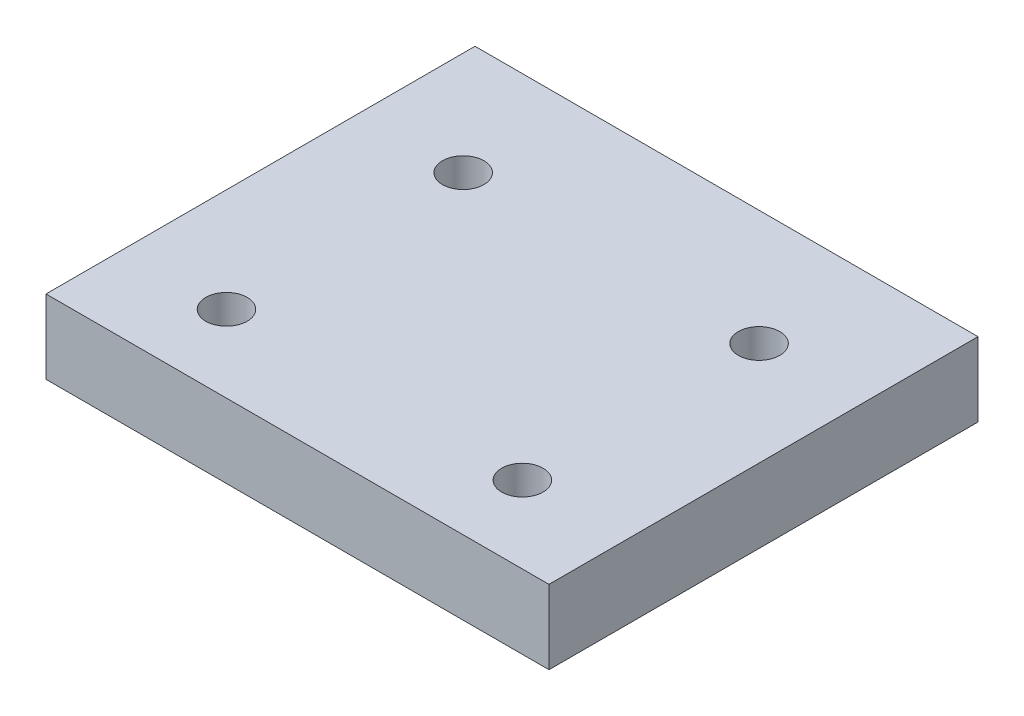
ISO-10303-21;
HEADER;
FILE_DESCRIPTION(('STEP AP214'),'2;1');
FILE_NAME('part.step','',(''),(''),'','','');
FILE_SCHEMA(('AUTOMOTIVE_DESIGN { 1 0 10303 214 1 1 1 1 }'));
ENDSEC;
DATA;
#1=APPLICATION_CONTEXT('core data for automotive mechanical design processes');
#2=APPLICATION_PROTOCOL_DEFINITION('international standard','automotive_design',2000,#1);
#3=PRODUCT_CONTEXT('',#1,'mechanical');
#4=PRODUCT('Part','Part','',(#3));
#5=PRODUCT_RELATED_PRODUCT_CATEGORY('part','',(#4));
#6=PRODUCT_DEFINITION_FORMATION('','',#4);
#7=PRODUCT_DEFINITION_CONTEXT('part definition',#1,'design');
#8=PRODUCT_DEFINITION('design','',#6,#7);
#9=PRODUCT_DEFINITION_SHAPE('','',#8);
#10=(LENGTH_UNIT() NAMED_UNIT(*) SI_UNIT(.MILLI.,.METRE.));
#11=(NAMED_UNIT(*) PLANE_ANGLE_UNIT() SI_UNIT($,.RADIAN.));
#12=(NAMED_UNIT(*) SI_UNIT($,.STERADIAN.) SOLID_ANGLE_UNIT());
#13=UNCERTAINTY_MEASURE_WITH_UNIT(LENGTH_MEASURE(1.E-05),#10,'distance_accuracy_value','');
#14=(GEOMETRIC_REPRESENTATION_CONTEXT(3) GLOBAL_UNCERTAINTY_ASSIGNED_CONTEXT((#13)) GLOBAL_UNIT_ASSIGNED_CONTEXT((#10,
#11,#12)) REPRESENTATION_CONTEXT('',''));
#15=CARTESIAN_POINT('',(0.,0.,0.));
#16=DIRECTION('',(0.,0.,1.));
#17=DIRECTION('',(1.,0.,0.));
#18=AXIS2_PLACEMENT_3D('',#15,#16,#17);
#19=CARTESIAN_POINT('',(0.,5.,0.));
#20=DIRECTION('',(0.,1.,0.));
#21=DIRECTION('',(0.,0.,1.));
#22=AXIS2_PLACEMENT_3D('',#19,#20,#21);
#23=PLANE('',#22);
#24=CARTESIAN_POINT('',(9.99999999999994,5.,-6.7));
#25=DIRECTION('',(0.,1.,0.));
#26=DIRECTION('',(0.,0.,1.));
#27=AXIS2_PLACEMENT_3D('',#24,#25,#26);
#28=CIRCLE('',#27,1.4);
#29=CARTESIAN_POINT('',(9.99999999999994,5.,-5.3));
#30=VERTEX_POINT('',#29);
#31=EDGE_CURVE('E148',#30,#30,#28,.T.);
#32=ORIENTED_EDGE('',*,*,#31,.F.);
#33=EDGE_LOOP('',(#32));
#34=FACE_BOUND('',#33,.T.);
#35=CARTESIAN_POINT('',(-10.,5.,9.3));
#36=DIRECTION('',(0.,1.,0.));
#37=DIRECTION('',(0.,0.,1.));
#38=AXIS2_PLACEMENT_3D('',#35,#36,#37);
#39=CIRCLE('',#38,1.4);
#40=CARTESIAN_POINT('',(-10.,5.,10.7));
#41=VERTEX_POINT('',#40);
#42=EDGE_CURVE('E118',#41,#41,#39,.T.);
#43=ORIENTED_EDGE('',*,*,#42,.F.);
#44=EDGE_LOOP('',(#43));
#45=FACE_BOUND('',#44,.T.);
#46=DIRECTION('',(0.,0.,-1.));
#47=VECTOR('',#46,1.);
#48=CARTESIAN_POINT('',(17.,5.,-14.5));
#49=LINE('',#48,#47);
#50=CARTESIAN_POINT('',(17.,5.,14.5));
#51=VERTEX_POINT('',#50);
#52=CARTESIAN_POINT('',(17.,5.,-14.5));
#53=VERTEX_POINT('',#52);
#54=EDGE_CURVE('E98',#51,#53,#49,.T.);
#55=ORIENTED_EDGE('',*,*,#54,.T.);
#56=DIRECTION('',(-1.,0.,0.));
#57=VECTOR('',#56,1.);
#58=CARTESIAN_POINT('',(-17.,5.,-14.5));
#59=LINE('',#58,#57);
#60=CARTESIAN_POINT('',(-17.,5.,-14.5));
#61=VERTEX_POINT('',#60);
#62=EDGE_CURVE('E93',#53,#61,#59,.T.);
#63=ORIENTED_EDGE('',*,*,#62,.T.);
#64=DIRECTION('',(0.,0.,1.));
#65=VECTOR('',#64,1.);
#66=CARTESIAN_POINT('',(-17.,5.,-14.5));
#67=LINE('',#66,#65);
#68=CARTESIAN_POINT('',(-17.,5.,14.5));
#69=VERTEX_POINT('',#68);
#70=EDGE_CURVE('E96',#61,#69,#67,.T.);
#71=ORIENTED_EDGE('',*,*,#70,.T.);
#72=DIRECTION('',(1.,0.,0.));
#73=VECTOR('',#72,1.);
#74=CARTESIAN_POINT('',(-17.,5.,14.5));
#75=LINE('',#74,#73);
#76=EDGE_CURVE('E63',#69,#51,#75,.T.);
#77=ORIENTED_EDGE('',*,*,#76,.T.);
#78=EDGE_LOOP('',(#55,#63,#71,#77));
#79=FACE_BOUND('',#78,.T.);
#80=CARTESIAN_POINT('',(10.,5.,9.3));
#81=DIRECTION('',(0.,1.,0.));
#82=DIRECTION('',(0.,0.,1.));
#83=AXIS2_PLACEMENT_3D('',#80,#81,#82);
#84=CIRCLE('',#83,1.4);
#85=CARTESIAN_POINT('',(10.,5.,10.7));
#86=VERTEX_POINT('',#85);
#87=EDGE_CURVE('E140',#86,#86,#84,.T.);
#88=ORIENTED_EDGE('',*,*,#87,.F.);
#89=EDGE_LOOP('',(#88));
#90=FACE_BOUND('',#89,.T.);
#91=CARTESIAN_POINT('',(-10.0000000000001,5.,-6.7));
#92=DIRECTION('',(0.,1.,0.));
#93=DIRECTION('',(0.,0.,1.));
#94=AXIS2_PLACEMENT_3D('',#91,#92,#93);
#95=CIRCLE('',#94,1.4);
#96=CARTESIAN_POINT('',(-10.0000000000001,5.,-5.3));
#97=VERTEX_POINT('',#96);
#98=EDGE_CURVE('E156',#97,#97,#95,.T.);
#99=ORIENTED_EDGE('',*,*,#98,.F.);
#100=EDGE_LOOP('',(#99));
#101=FACE_BOUND('',#100,.T.);
#102=ADVANCED_FACE('F45',(#34,#45,#79,#90,#101),#23,.T.);
#103=CARTESIAN_POINT('',(0.,0.,0.));
#104=DIRECTION('',(0.,1.,0.));
#105=DIRECTION('',(0.,0.,1.));
#106=AXIS2_PLACEMENT_3D('',#103,#104,#105);
#107=PLANE('',#106);
#108=DIRECTION('',(0.,0.,-1.));
#109=VECTOR('',#108,1.);
#110=CARTESIAN_POINT('',(17.,0.,-14.5));
#111=LINE('',#110,#109);
#112=CARTESIAN_POINT('',(17.,0.,14.5));
#113=VERTEX_POINT('',#112);
#114=CARTESIAN_POINT('',(17.,0.,-14.5));
#115=VERTEX_POINT('',#114);
#116=EDGE_CURVE('E114',#113,#115,#111,.T.);
#117=ORIENTED_EDGE('',*,*,#116,.F.);
#118=DIRECTION('',(1.,0.,0.));
#119=VECTOR('',#118,1.);
#120=CARTESIAN_POINT('',(-17.,0.,14.5));
#121=LINE('',#120,#119);
#122=CARTESIAN_POINT('',(-17.,0.,14.5));
#123=VERTEX_POINT('',#122);
#124=EDGE_CURVE('E86',#123,#113,#121,.T.);
#125=ORIENTED_EDGE('',*,*,#124,.F.);
#126=DIRECTION('',(0.,0.,1.));
#127=VECTOR('',#126,1.);
#128=CARTESIAN_POINT('',(-17.,0.,-14.5));
#129=LINE('',#128,#127);
#130=CARTESIAN_POINT('',(-17.,0.,-14.5));
#131=VERTEX_POINT('',#130);
#132=EDGE_CURVE('E80',#131,#123,#129,.T.);
#133=ORIENTED_EDGE('',*,*,#132,.F.);
#134=DIRECTION('',(-1.,0.,0.));
#135=VECTOR('',#134,1.);
#136=CARTESIAN_POINT('',(-17.,0.,-14.5));
#137=LINE('',#136,#135);
#138=EDGE_CURVE('E103',#115,#131,#137,.T.);
#139=ORIENTED_EDGE('',*,*,#138,.F.);
#140=EDGE_LOOP('',(#117,#125,#133,#139));
#141=FACE_BOUND('',#140,.T.);
#142=CARTESIAN_POINT('',(-10.,0.,9.3));
#143=DIRECTION('',(0.,1.,0.));
#144=DIRECTION('',(0.,0.,1.));
#145=AXIS2_PLACEMENT_3D('',#142,#143,#144);
#146=CIRCLE('',#145,1.4);
#147=CARTESIAN_POINT('',(-10.,0.,10.7));
#148=VERTEX_POINT('',#147);
#149=EDGE_CURVE('E136',#148,#148,#146,.T.);
#150=ORIENTED_EDGE('',*,*,#149,.T.);
#151=EDGE_LOOP('',(#150));
#152=FACE_BOUND('',#151,.T.);
#153=CARTESIAN_POINT('',(10.,0.,9.3));
#154=DIRECTION('',(0.,1.,0.));
#155=DIRECTION('',(0.,0.,1.));
#156=AXIS2_PLACEMENT_3D('',#153,#154,#155);
#157=CIRCLE('',#156,1.4);
#158=CARTESIAN_POINT('',(10.,0.,10.7));
#159=VERTEX_POINT('',#158);
#160=EDGE_CURVE('E144',#159,#159,#157,.T.);
#161=ORIENTED_EDGE('',*,*,#160,.T.);
#162=EDGE_LOOP('',(#161));
#163=FACE_BOUND('',#162,.T.);
#164=CARTESIAN_POINT('',(9.99999999999994,0.,-6.7));
#165=DIRECTION('',(0.,1.,0.));
#166=DIRECTION('',(0.,0.,1.));
#167=AXIS2_PLACEMENT_3D('',#164,#165,#166);
#168=CIRCLE('',#167,1.4);
#169=CARTESIAN_POINT('',(9.99999999999994,0.,-5.3));
#170=VERTEX_POINT('',#169);
#171=EDGE_CURVE('E152',#170,#170,#168,.T.);
#172=ORIENTED_EDGE('',*,*,#171,.T.);
#173=EDGE_LOOP('',(#172));
#174=FACE_BOUND('',#173,.T.);
#175=CARTESIAN_POINT('',(-10.0000000000001,0.,-6.7));
#176=DIRECTION('',(0.,1.,0.));
#177=DIRECTION('',(0.,0.,1.));
#178=AXIS2_PLACEMENT_3D('',#175,#176,#177);
#179=CIRCLE('',#178,1.4);
#180=CARTESIAN_POINT('',(-10.0000000000001,0.,-5.3));
#181=VERTEX_POINT('',#180);
#182=EDGE_CURVE('E160',#181,#181,#179,.T.);
#183=ORIENTED_EDGE('',*,*,#182,.T.);
#184=EDGE_LOOP('',(#183));
#185=FACE_BOUND('',#184,.T.);
#186=ADVANCED_FACE('F131',(#141,#152,#163,#174,#185),#107,.F.);
#187=CARTESIAN_POINT('',(17.,5.,-14.5));
#188=DIRECTION('',(-1.,0.,0.));
#189=DIRECTION('',(0.,0.,1.));
#190=AXIS2_PLACEMENT_3D('',#187,#188,#189);
#191=PLANE('',#190);
#192=ORIENTED_EDGE('',*,*,#116,.T.);
#193=DIRECTION('',(0.,-1.,0.));
#194=VECTOR('',#193,1.);
#195=CARTESIAN_POINT('',(17.,5.,-14.5));
#196=LINE('',#195,#194);
#197=EDGE_CURVE('E11',#53,#115,#196,.T.);
#198=ORIENTED_EDGE('',*,*,#197,.F.);
#199=ORIENTED_EDGE('',*,*,#54,.F.);
#200=DIRECTION('',(0.,-1.,0.));
#201=VECTOR('',#200,1.);
#202=CARTESIAN_POINT('',(17.,5.,14.5));
#203=LINE('',#202,#201);
#204=EDGE_CURVE('E110',#51,#113,#203,.T.);
#205=ORIENTED_EDGE('',*,*,#204,.T.);
#206=EDGE_LOOP('',(#192,#198,#199,#205));
#207=FACE_BOUND('',#206,.T.);
#208=ADVANCED_FACE('F47',(#207),#191,.F.);
#209=CARTESIAN_POINT('',(-17.,5.,-14.5));
#210=DIRECTION('',(0.,0.,1.));
#211=DIRECTION('',(1.,0.,0.));
#212=AXIS2_PLACEMENT_3D('',#209,#210,#211);
#213=PLANE('',#212);
#214=ORIENTED_EDGE('',*,*,#138,.T.);
#215=DIRECTION('',(0.,-1.,0.));
#216=VECTOR('',#215,1.);
#217=CARTESIAN_POINT('',(-17.,5.,-14.5));
#218=LINE('',#217,#216);
#219=EDGE_CURVE('E55',#61,#131,#218,.T.);
#220=ORIENTED_EDGE('',*,*,#219,.F.);
#221=ORIENTED_EDGE('',*,*,#62,.F.);
#222=ORIENTED_EDGE('',*,*,#197,.T.);
#223=EDGE_LOOP('',(#214,#220,#221,#222));
#224=FACE_BOUND('',#223,.T.);
#225=ADVANCED_FACE('F102',(#224),#213,.F.);
#226=CARTESIAN_POINT('',(-17.,5.,-14.5));
#227=DIRECTION('',(1.,0.,0.));
#228=DIRECTION('',(0.,0.,-1.));
#229=AXIS2_PLACEMENT_3D('',#226,#227,#228);
#230=PLANE('',#229);
#231=ORIENTED_EDGE('',*,*,#132,.T.);
#232=DIRECTION('',(0.,-1.,0.));
#233=VECTOR('',#232,1.);
#234=CARTESIAN_POINT('',(-17.,5.,14.5));
#235=LINE('',#234,#233);
#236=EDGE_CURVE('E105',#69,#123,#235,.T.);
#237=ORIENTED_EDGE('',*,*,#236,.F.);
#238=ORIENTED_EDGE('',*,*,#70,.F.);
#239=ORIENTED_EDGE('',*,*,#219,.T.);
#240=EDGE_LOOP('',(#231,#237,#238,#239));
#241=FACE_BOUND('',#240,.T.);
#242=ADVANCED_FACE('F106',(#241),#230,.F.);
#243=CARTESIAN_POINT('',(-17.,5.,14.5));
#244=DIRECTION('',(0.,0.,-1.));
#245=DIRECTION('',(-1.,0.,0.));
#246=AXIS2_PLACEMENT_3D('',#243,#244,#245);
#247=PLANE('',#246);
#248=ORIENTED_EDGE('',*,*,#124,.T.);
#249=ORIENTED_EDGE('',*,*,#204,.F.);
#250=ORIENTED_EDGE('',*,*,#76,.F.);
#251=ORIENTED_EDGE('',*,*,#236,.T.);
#252=EDGE_LOOP('',(#248,#249,#250,#251));
#253=FACE_BOUND('',#252,.T.);
#254=ADVANCED_FACE('F128',(#253),#247,.F.);
#255=CARTESIAN_POINT('',(-10.,5.,9.3));
#256=DIRECTION('',(0.,-1.,0.));
#257=DIRECTION('',(0.,0.,-1.));
#258=AXIS2_PLACEMENT_3D('',#255,#256,#257);
#259=CYLINDRICAL_SURFACE('',#258,1.4);
#260=ORIENTED_EDGE('',*,*,#42,.T.);
#261=EDGE_LOOP('',(#260));
#262=FACE_BOUND('',#261,.T.);
#263=ORIENTED_EDGE('',*,*,#149,.F.);
#264=EDGE_LOOP('',(#263));
#265=FACE_BOUND('',#264,.T.);
#266=ADVANCED_FACE('F181',(#262,#265),#259,.F.);
#267=CARTESIAN_POINT('',(10.,5.,9.3));
#268=DIRECTION('',(0.,-1.,0.));
#269=DIRECTION('',(0.,0.,-1.));
#270=AXIS2_PLACEMENT_3D('',#267,#268,#269);
#271=CYLINDRICAL_SURFACE('',#270,1.4);
#272=ORIENTED_EDGE('',*,*,#87,.T.);
#273=EDGE_LOOP('',(#272));
#274=FACE_BOUND('',#273,.T.);
#275=ORIENTED_EDGE('',*,*,#160,.F.);
#276=EDGE_LOOP('',(#275));
#277=FACE_BOUND('',#276,.T.);
#278=ADVANCED_FACE('F226',(#274,#277),#271,.F.);
#279=CARTESIAN_POINT('',(9.99999999999994,5.,-6.7));
#280=DIRECTION('',(0.,-1.,0.));
#281=DIRECTION('',(0.,0.,-1.));
#282=AXIS2_PLACEMENT_3D('',#279,#280,#281);
#283=CYLINDRICAL_SURFACE('',#282,1.4);
#284=ORIENTED_EDGE('',*,*,#31,.T.);
#285=EDGE_LOOP('',(#284));
#286=FACE_BOUND('',#285,.T.);
#287=ORIENTED_EDGE('',*,*,#171,.F.);
#288=EDGE_LOOP('',(#287));
#289=FACE_BOUND('',#288,.T.);
#290=ADVANCED_FACE('F234',(#286,#289),#283,.F.);
#291=CARTESIAN_POINT('',(-10.0000000000001,5.,-6.7));
#292=DIRECTION('',(0.,-1.,0.));
#293=DIRECTION('',(0.,0.,-1.));
#294=AXIS2_PLACEMENT_3D('',#291,#292,#293);
#295=CYLINDRICAL_SURFACE('',#294,1.4);
#296=ORIENTED_EDGE('',*,*,#98,.T.);
#297=EDGE_LOOP('',(#296));
#298=FACE_BOUND('',#297,.T.);
#299=ORIENTED_EDGE('',*,*,#182,.F.);
#300=EDGE_LOOP('',(#299));
#301=FACE_BOUND('',#300,.T.);
#302=ADVANCED_FACE('F168',(#298,#301),#295,.F.);
#303=CLOSED_SHELL('',(#102,#186,#208,#225,#242,#254,#266,#278,#290,#302));
#304=MANIFOLD_SOLID_BREP('B2',#303);
#305=ADVANCED_BREP_SHAPE_REPRESENTATION('',(#18,#304),#14);
#306=SHAPE_DEFINITION_REPRESENTATION(#9,#305);
ENDSEC;
END-ISO-10303-21;
